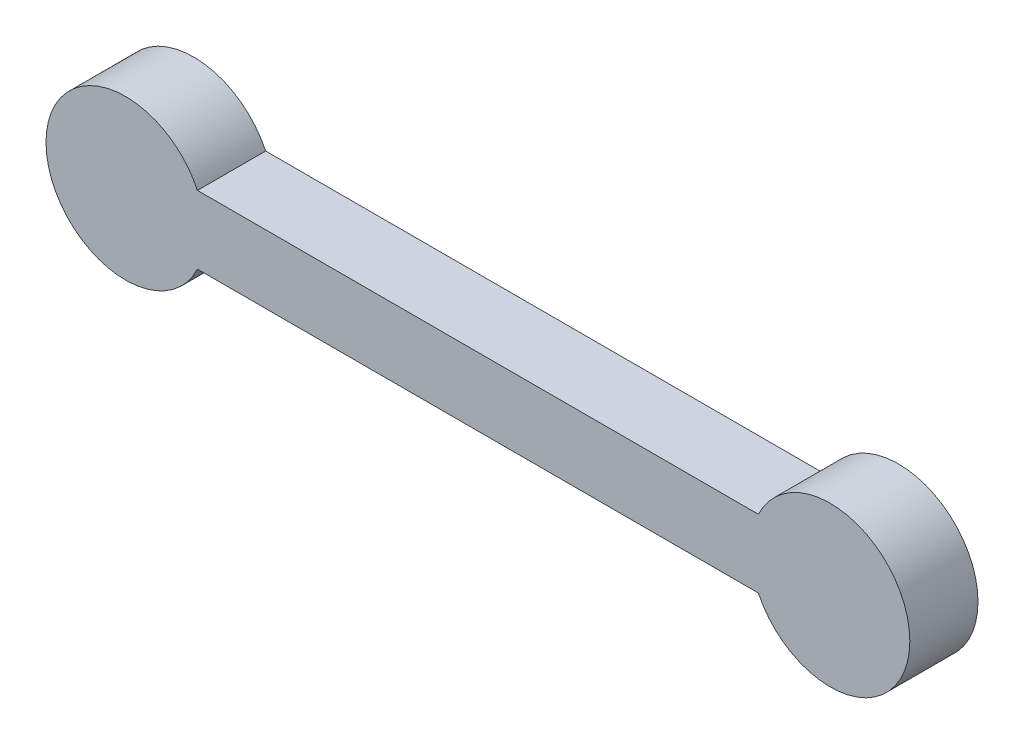
ISO-10303-21;
HEADER;
FILE_DESCRIPTION(('STEP AP214'),'2;1');
FILE_NAME('part.step','',(''),(''),'','','');
FILE_SCHEMA(('AUTOMOTIVE_DESIGN { 1 0 10303 214 1 1 1 1 }'));
ENDSEC;
DATA;
#1=APPLICATION_CONTEXT('core data for automotive mechanical design processes');
#2=APPLICATION_PROTOCOL_DEFINITION('international standard','automotive_design',2000,#1);
#3=PRODUCT_CONTEXT('',#1,'mechanical');
#4=PRODUCT('Part','Part','',(#3));
#5=PRODUCT_RELATED_PRODUCT_CATEGORY('part','',(#4));
#6=PRODUCT_DEFINITION_FORMATION('','',#4);
#7=PRODUCT_DEFINITION_CONTEXT('part definition',#1,'design');
#8=PRODUCT_DEFINITION('design','',#6,#7);
#9=PRODUCT_DEFINITION_SHAPE('','',#8);
#10=(LENGTH_UNIT() NAMED_UNIT(*) SI_UNIT(.MILLI.,.METRE.));
#11=(NAMED_UNIT(*) PLANE_ANGLE_UNIT() SI_UNIT($,.RADIAN.));
#12=(NAMED_UNIT(*) SI_UNIT($,.STERADIAN.) SOLID_ANGLE_UNIT());
#13=UNCERTAINTY_MEASURE_WITH_UNIT(LENGTH_MEASURE(1.E-05),#10,'distance_accuracy_value','');
#14=(GEOMETRIC_REPRESENTATION_CONTEXT(3) GLOBAL_UNCERTAINTY_ASSIGNED_CONTEXT((#13)) GLOBAL_UNIT_ASSIGNED_CONTEXT((#10,
#11,#12)) REPRESENTATION_CONTEXT('',''));
#15=CARTESIAN_POINT('',(0.,0.,0.));
#16=DIRECTION('',(0.,0.,1.));
#17=DIRECTION('',(1.,0.,0.));
#18=AXIS2_PLACEMENT_3D('',#15,#16,#17);
#19=CARTESIAN_POINT('',(0.,-1.5,3.));
#20=DIRECTION('',(0.,1.,0.));
#21=DIRECTION('',(0.,0.,1.));
#22=AXIS2_PLACEMENT_3D('',#19,#20,#21);
#23=PLANE('',#22);
#24=DIRECTION('',(0.,0.,-1.));
#25=VECTOR('',#24,1.);
#26=CARTESIAN_POINT('',(27.8377223398316,-1.5,3.));
#27=LINE('',#26,#25);
#28=CARTESIAN_POINT('',(27.8377223398316,-1.5,3.));
#29=VERTEX_POINT('',#28);
#30=CARTESIAN_POINT('',(27.8377223398316,-1.5,0.));
#31=VERTEX_POINT('',#30);
#32=EDGE_CURVE('E59',#29,#31,#27,.T.);
#33=ORIENTED_EDGE('',*,*,#32,.F.);
#34=DIRECTION('',(1.,0.,0.));
#35=VECTOR('',#34,1.);
#36=CARTESIAN_POINT('',(0.,-1.5,3.));
#37=LINE('',#36,#35);
#38=CARTESIAN_POINT('',(3.16227766016838,-1.5,3.));
#39=VERTEX_POINT('',#38);
#40=EDGE_CURVE('E86',#39,#29,#37,.T.);
#41=ORIENTED_EDGE('',*,*,#40,.F.);
#42=DIRECTION('',(0.,0.,-1.));
#43=VECTOR('',#42,1.);
#44=CARTESIAN_POINT('',(3.16227766016838,-1.5,3.));
#45=LINE('',#44,#43);
#46=CARTESIAN_POINT('',(3.16227766016838,-1.5,0.));
#47=VERTEX_POINT('',#46);
#48=EDGE_CURVE('E91',#39,#47,#45,.T.);
#49=ORIENTED_EDGE('',*,*,#48,.T.);
#50=DIRECTION('',(1.,0.,0.));
#51=VECTOR('',#50,1.);
#52=CARTESIAN_POINT('',(0.,-1.5,0.));
#53=LINE('',#52,#51);
#54=EDGE_CURVE('E53',#47,#31,#53,.T.);
#55=ORIENTED_EDGE('',*,*,#54,.T.);
#56=EDGE_LOOP('',(#33,#41,#49,#55));
#57=FACE_BOUND('',#56,.T.);
#58=ADVANCED_FACE('F39',(#57),#23,.F.);
#59=CARTESIAN_POINT('',(0.,1.5,3.));
#60=DIRECTION('',(0.,-1.,0.));
#61=DIRECTION('',(0.,0.,-1.));
#62=AXIS2_PLACEMENT_3D('',#59,#60,#61);
#63=PLANE('',#62);
#64=DIRECTION('',(0.,0.,-1.));
#65=VECTOR('',#64,1.);
#66=CARTESIAN_POINT('',(27.8377223398316,1.5,3.));
#67=LINE('',#66,#65);
#68=CARTESIAN_POINT('',(27.8377223398316,1.5,0.));
#69=VERTEX_POINT('',#68);
#70=CARTESIAN_POINT('',(27.8377223398316,1.5,3.));
#71=VERTEX_POINT('',#70);
#72=EDGE_CURVE('E11',#69,#71,#67,.F.);
#73=ORIENTED_EDGE('',*,*,#72,.F.);
#74=DIRECTION('',(-1.,0.,0.));
#75=VECTOR('',#74,1.);
#76=CARTESIAN_POINT('',(0.,1.5,0.));
#77=LINE('',#76,#75);
#78=CARTESIAN_POINT('',(3.16227766016838,1.5,0.));
#79=VERTEX_POINT('',#78);
#80=EDGE_CURVE('E98',#69,#79,#77,.T.);
#81=ORIENTED_EDGE('',*,*,#80,.T.);
#82=DIRECTION('',(0.,0.,-1.));
#83=VECTOR('',#82,1.);
#84=CARTESIAN_POINT('',(3.16227766016838,1.5,3.));
#85=LINE('',#84,#83);
#86=CARTESIAN_POINT('',(3.16227766016838,1.5,3.));
#87=VERTEX_POINT('',#86);
#88=EDGE_CURVE('E87',#79,#87,#85,.F.);
#89=ORIENTED_EDGE('',*,*,#88,.T.);
#90=DIRECTION('',(-1.,0.,0.));
#91=VECTOR('',#90,1.);
#92=CARTESIAN_POINT('',(0.,1.5,3.));
#93=LINE('',#92,#91);
#94=EDGE_CURVE('E78',#71,#87,#93,.T.);
#95=ORIENTED_EDGE('',*,*,#94,.F.);
#96=EDGE_LOOP('',(#73,#81,#89,#95));
#97=FACE_BOUND('',#96,.T.);
#98=ADVANCED_FACE('F96',(#97),#63,.F.);
#99=CARTESIAN_POINT('',(0.,0.,3.));
#100=DIRECTION('',(0.,0.,-1.));
#101=DIRECTION('',(-1.,0.,0.));
#102=AXIS2_PLACEMENT_3D('',#99,#100,#101);
#103=CYLINDRICAL_SURFACE('',#102,3.5);
#104=ORIENTED_EDGE('',*,*,#48,.F.);
#105=CARTESIAN_POINT('',(0.,0.,3.));
#106=DIRECTION('',(0.,0.,1.));
#107=DIRECTION('',(1.,0.,0.));
#108=AXIS2_PLACEMENT_3D('',#105,#106,#107);
#109=CIRCLE('',#108,3.5);
#110=EDGE_CURVE('E50',#87,#39,#109,.T.);
#111=ORIENTED_EDGE('',*,*,#110,.F.);
#112=ORIENTED_EDGE('',*,*,#88,.F.);
#113=CARTESIAN_POINT('',(0.,0.,0.));
#114=DIRECTION('',(0.,0.,1.));
#115=DIRECTION('',(1.,0.,0.));
#116=AXIS2_PLACEMENT_3D('',#113,#114,#115);
#117=CIRCLE('',#116,3.5);
#118=EDGE_CURVE('E94',#79,#47,#117,.T.);
#119=ORIENTED_EDGE('',*,*,#118,.T.);
#120=EDGE_LOOP('',(#104,#111,#112,#119));
#121=FACE_BOUND('',#120,.T.);
#122=ADVANCED_FACE('F41',(#121),#103,.T.);
#123=CARTESIAN_POINT('',(0.,0.,3.));
#124=DIRECTION('',(0.,0.,1.));
#125=DIRECTION('',(1.,0.,0.));
#126=AXIS2_PLACEMENT_3D('',#123,#124,#125);
#127=PLANE('',#126);
#128=CARTESIAN_POINT('',(31.,0.,3.));
#129=DIRECTION('',(0.,0.,1.));
#130=DIRECTION('',(1.,0.,0.));
#131=AXIS2_PLACEMENT_3D('',#128,#129,#130);
#132=CIRCLE('',#131,3.5);
#133=EDGE_CURVE('E82',#29,#71,#132,.T.);
#134=ORIENTED_EDGE('',*,*,#133,.T.);
#135=ORIENTED_EDGE('',*,*,#94,.T.);
#136=ORIENTED_EDGE('',*,*,#110,.T.);
#137=ORIENTED_EDGE('',*,*,#40,.T.);
#138=EDGE_LOOP('',(#134,#135,#136,#137));
#139=FACE_BOUND('',#138,.T.);
#140=ADVANCED_FACE('F85',(#139),#127,.T.);
#141=CARTESIAN_POINT('',(0.,0.,0.));
#142=DIRECTION('',(0.,0.,1.));
#143=DIRECTION('',(1.,0.,0.));
#144=AXIS2_PLACEMENT_3D('',#141,#142,#143);
#145=PLANE('',#144);
#146=ORIENTED_EDGE('',*,*,#80,.F.);
#147=CARTESIAN_POINT('',(31.,0.,0.));
#148=DIRECTION('',(0.,0.,1.));
#149=DIRECTION('',(1.,0.,0.));
#150=AXIS2_PLACEMENT_3D('',#147,#148,#149);
#151=CIRCLE('',#150,3.5);
#152=EDGE_CURVE('E110',#31,#69,#151,.T.);
#153=ORIENTED_EDGE('',*,*,#152,.F.);
#154=ORIENTED_EDGE('',*,*,#54,.F.);
#155=ORIENTED_EDGE('',*,*,#118,.F.);
#156=EDGE_LOOP('',(#146,#153,#154,#155));
#157=FACE_BOUND('',#156,.T.);
#158=ADVANCED_FACE('F104',(#157),#145,.F.);
#159=CARTESIAN_POINT('',(31.,0.,3.));
#160=DIRECTION('',(0.,0.,-1.));
#161=DIRECTION('',(-1.,0.,0.));
#162=AXIS2_PLACEMENT_3D('',#159,#160,#161);
#163=CYLINDRICAL_SURFACE('',#162,3.5);
#164=ORIENTED_EDGE('',*,*,#133,.F.);
#165=ORIENTED_EDGE('',*,*,#32,.T.);
#166=ORIENTED_EDGE('',*,*,#152,.T.);
#167=ORIENTED_EDGE('',*,*,#72,.T.);
#168=EDGE_LOOP('',(#164,#165,#166,#167));
#169=FACE_BOUND('',#168,.T.);
#170=ADVANCED_FACE('F114',(#169),#163,.T.);
#171=CLOSED_SHELL('',(#58,#98,#122,#140,#158,#170));
#172=MANIFOLD_SOLID_BREP('B2',#171);
#173=ADVANCED_BREP_SHAPE_REPRESENTATION('',(#18,#172),#14);
#174=SHAPE_DEFINITION_REPRESENTATION(#9,#173);
ENDSEC;
END-ISO-10303-21;
